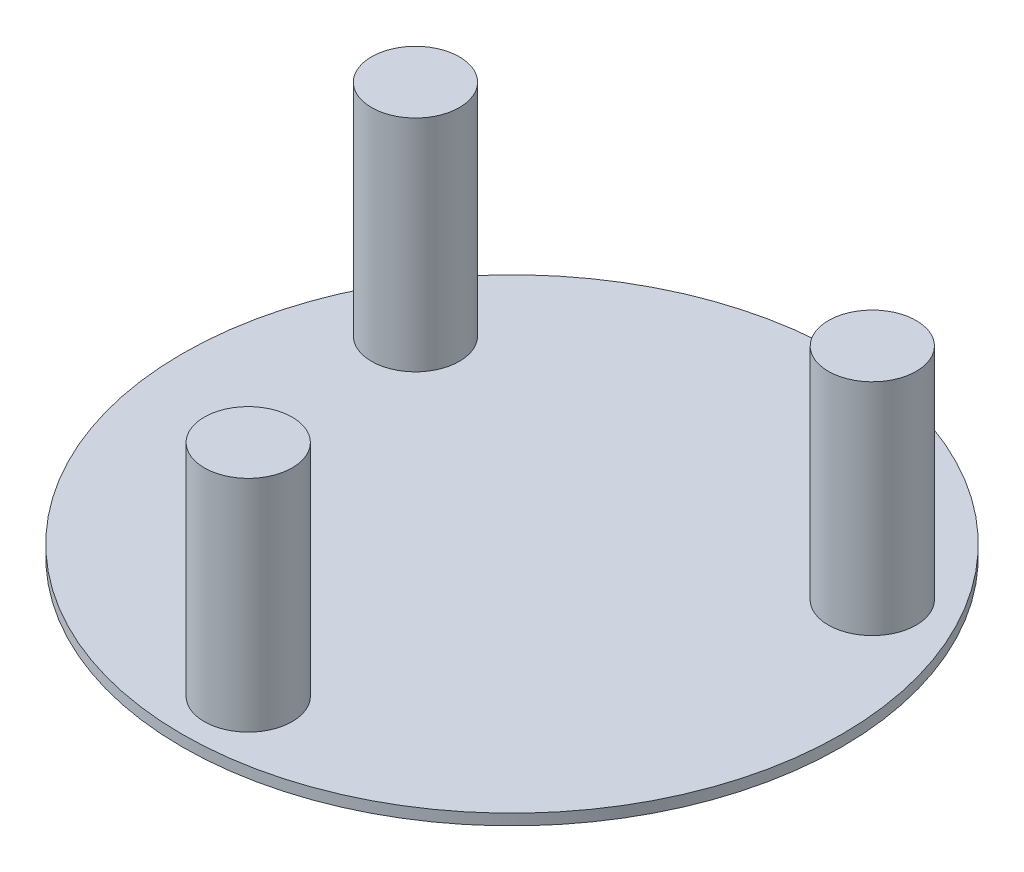
ISO-10303-21;
HEADER;
FILE_DESCRIPTION(('STEP AP214'),'2;1');
FILE_NAME('part.step','',(''),(''),'','','');
FILE_SCHEMA(('AUTOMOTIVE_DESIGN { 1 0 10303 214 1 1 1 1 }'));
ENDSEC;
DATA;
#1=APPLICATION_CONTEXT('core data for automotive mechanical design processes');
#2=APPLICATION_PROTOCOL_DEFINITION('international standard','automotive_design',2000,#1);
#3=PRODUCT_CONTEXT('',#1,'mechanical');
#4=PRODUCT('Part','Part','',(#3));
#5=PRODUCT_RELATED_PRODUCT_CATEGORY('part','',(#4));
#6=PRODUCT_DEFINITION_FORMATION('','',#4);
#7=PRODUCT_DEFINITION_CONTEXT('part definition',#1,'design');
#8=PRODUCT_DEFINITION('design','',#6,#7);
#9=PRODUCT_DEFINITION_SHAPE('','',#8);
#10=(LENGTH_UNIT() NAMED_UNIT(*) SI_UNIT(.MILLI.,.METRE.));
#11=(NAMED_UNIT(*) PLANE_ANGLE_UNIT() SI_UNIT($,.RADIAN.));
#12=(NAMED_UNIT(*) SI_UNIT($,.STERADIAN.) SOLID_ANGLE_UNIT());
#13=UNCERTAINTY_MEASURE_WITH_UNIT(LENGTH_MEASURE(1.E-05),#10,'distance_accuracy_value','');
#14=(GEOMETRIC_REPRESENTATION_CONTEXT(3) GLOBAL_UNCERTAINTY_ASSIGNED_CONTEXT((#13)) GLOBAL_UNIT_ASSIGNED_CONTEXT((#10,
#11,#12)) REPRESENTATION_CONTEXT('',''));
#15=CARTESIAN_POINT('',(0.,0.,0.));
#16=DIRECTION('',(0.,0.,1.));
#17=DIRECTION('',(1.,0.,0.));
#18=AXIS2_PLACEMENT_3D('',#15,#16,#17);
#19=CARTESIAN_POINT('',(0.,5.,0.));
#20=DIRECTION('',(0.,-1.,0.));
#21=DIRECTION('',(0.,0.,-1.));
#22=AXIS2_PLACEMENT_3D('',#19,#20,#21);
#23=CYLINDRICAL_SURFACE('',#22,150.);
#24=CARTESIAN_POINT('',(0.,5.,0.));
#25=DIRECTION('',(0.,1.,0.));
#26=DIRECTION('',(0.,0.,1.));
#27=AXIS2_PLACEMENT_3D('',#24,#25,#26);
#28=CIRCLE('',#27,150.);
#29=CARTESIAN_POINT('',(0.,5.,150.));
#30=VERTEX_POINT('',#29);
#31=EDGE_CURVE('E41',#30,#30,#28,.T.);
#32=ORIENTED_EDGE('',*,*,#31,.F.);
#33=EDGE_LOOP('',(#32));
#34=FACE_BOUND('',#33,.T.);
#35=CARTESIAN_POINT('',(0.,0.,0.));
#36=DIRECTION('',(0.,1.,0.));
#37=DIRECTION('',(0.,0.,1.));
#38=AXIS2_PLACEMENT_3D('',#35,#36,#37);
#39=CIRCLE('',#38,150.);
#40=CARTESIAN_POINT('',(0.,0.,150.));
#41=VERTEX_POINT('',#40);
#42=EDGE_CURVE('E45',#41,#41,#39,.T.);
#43=ORIENTED_EDGE('',*,*,#42,.T.);
#44=EDGE_LOOP('',(#43));
#45=FACE_BOUND('',#44,.T.);
#46=ADVANCED_FACE('F35',(#34,#45),#23,.T.);
#47=CARTESIAN_POINT('',(0.,5.,0.));
#48=DIRECTION('',(0.,1.,0.));
#49=DIRECTION('',(0.,0.,1.));
#50=AXIS2_PLACEMENT_3D('',#47,#48,#49);
#51=PLANE('',#50);
#52=CARTESIAN_POINT('',(-103.923048454133,5.,-59.999999999999));
#53=DIRECTION('',(0.,1.,0.));
#54=DIRECTION('',(-0.866025403784443,0.,-0.499999999999992));
#55=AXIS2_PLACEMENT_3D('',#52,#53,#54);
#56=CIRCLE('',#55,20.);
#57=CARTESIAN_POINT('',(-121.243556529822,5.,-69.9999999999989));
#58=VERTEX_POINT('',#57);
#59=EDGE_CURVE('E64',#58,#58,#56,.T.);
#60=ORIENTED_EDGE('',*,*,#59,.F.);
#61=EDGE_LOOP('',(#60));
#62=FACE_BOUND('',#61,.T.);
#63=CARTESIAN_POINT('',(103.923048454132,5.,-60.0000000000005));
#64=DIRECTION('',(0.,1.,0.));
#65=DIRECTION('',(0.866025403784436,0.,-0.500000000000004));
#66=AXIS2_PLACEMENT_3D('',#63,#64,#65);
#67=CIRCLE('',#66,20.);
#68=CARTESIAN_POINT('',(121.243556529821,5.,-70.0000000000006));
#69=VERTEX_POINT('',#68);
#70=EDGE_CURVE('E58',#69,#69,#67,.T.);
#71=ORIENTED_EDGE('',*,*,#70,.F.);
#72=EDGE_LOOP('',(#71));
#73=FACE_BOUND('',#72,.T.);
#74=CARTESIAN_POINT('',(0.,5.,120.));
#75=DIRECTION('',(0.,1.,0.));
#76=DIRECTION('',(0.,0.,1.));
#77=AXIS2_PLACEMENT_3D('',#74,#75,#76);
#78=CIRCLE('',#77,20.);
#79=CARTESIAN_POINT('',(0.,5.,140.));
#80=VERTEX_POINT('',#79);
#81=EDGE_CURVE('E52',#80,#80,#78,.T.);
#82=ORIENTED_EDGE('',*,*,#81,.F.);
#83=EDGE_LOOP('',(#82));
#84=FACE_BOUND('',#83,.T.);
#85=ORIENTED_EDGE('',*,*,#31,.T.);
#86=EDGE_LOOP('',(#85));
#87=FACE_BOUND('',#86,.T.);
#88=ADVANCED_FACE('F88',(#62,#73,#84,#87),#51,.T.);
#89=CARTESIAN_POINT('',(0.,0.,0.));
#90=DIRECTION('',(0.,1.,0.));
#91=DIRECTION('',(0.,0.,1.));
#92=AXIS2_PLACEMENT_3D('',#89,#90,#91);
#93=PLANE('',#92);
#94=CARTESIAN_POINT('',(0.,0.,0.));
#95=DIRECTION('',(0.,1.,0.));
#96=DIRECTION('',(0.,0.,1.));
#97=AXIS2_PLACEMENT_3D('',#94,#95,#96);
#98=CIRCLE('',#97,2.5);
#99=CARTESIAN_POINT('',(0.,0.,2.5));
#100=VERTEX_POINT('',#99);
#101=EDGE_CURVE('E10',#100,#100,#98,.F.);
#102=ORIENTED_EDGE('',*,*,#101,.F.);
#103=EDGE_LOOP('',(#102));
#104=FACE_BOUND('',#103,.T.);
#105=ORIENTED_EDGE('',*,*,#42,.F.);
#106=EDGE_LOOP('',(#105));
#107=FACE_BOUND('',#106,.T.);
#108=ADVANCED_FACE('F93',(#104,#107),#93,.F.);
#109=CARTESIAN_POINT('',(0.,105.,120.));
#110=DIRECTION('',(0.,-1.,0.));
#111=DIRECTION('',(0.,0.,-1.));
#112=AXIS2_PLACEMENT_3D('',#109,#110,#111);
#113=CYLINDRICAL_SURFACE('',#112,20.);
#114=CARTESIAN_POINT('',(0.,105.,120.));
#115=DIRECTION('',(0.,1.,0.));
#116=DIRECTION('',(0.,0.,1.));
#117=AXIS2_PLACEMENT_3D('',#114,#115,#116);
#118=CIRCLE('',#117,20.);
#119=CARTESIAN_POINT('',(0.,105.,140.));
#120=VERTEX_POINT('',#119);
#121=EDGE_CURVE('E50',#120,#120,#118,.T.);
#122=ORIENTED_EDGE('',*,*,#121,.F.);
#123=EDGE_LOOP('',(#122));
#124=FACE_BOUND('',#123,.T.);
#125=ORIENTED_EDGE('',*,*,#81,.T.);
#126=EDGE_LOOP('',(#125));
#127=FACE_BOUND('',#126,.T.);
#128=ADVANCED_FACE('F100',(#124,#127),#113,.T.);
#129=CARTESIAN_POINT('',(0.,105.,120.));
#130=DIRECTION('',(0.,1.,0.));
#131=DIRECTION('',(0.,0.,1.));
#132=AXIS2_PLACEMENT_3D('',#129,#130,#131);
#133=PLANE('',#132);
#134=ORIENTED_EDGE('',*,*,#121,.T.);
#135=EDGE_LOOP('',(#134));
#136=FACE_BOUND('',#135,.T.);
#137=ADVANCED_FACE('F105',(#136),#133,.T.);
#138=CARTESIAN_POINT('',(103.923048454132,105.,-60.0000000000005));
#139=DIRECTION('',(0.,-1.,0.));
#140=DIRECTION('',(0.,0.,-1.));
#141=AXIS2_PLACEMENT_3D('',#138,#139,#140);
#142=CYLINDRICAL_SURFACE('',#141,20.);
#143=CARTESIAN_POINT('',(103.923048454132,105.,-60.0000000000005));
#144=DIRECTION('',(0.,1.,0.));
#145=DIRECTION('',(0.866025403784436,0.,-0.500000000000004));
#146=AXIS2_PLACEMENT_3D('',#143,#144,#145);
#147=CIRCLE('',#146,20.);
#148=CARTESIAN_POINT('',(121.243556529821,105.,-70.0000000000006));
#149=VERTEX_POINT('',#148);
#150=EDGE_CURVE('E55',#149,#149,#147,.T.);
#151=ORIENTED_EDGE('',*,*,#150,.F.);
#152=EDGE_LOOP('',(#151));
#153=FACE_BOUND('',#152,.T.);
#154=ORIENTED_EDGE('',*,*,#70,.T.);
#155=EDGE_LOOP('',(#154));
#156=FACE_BOUND('',#155,.T.);
#157=ADVANCED_FACE('F111',(#153,#156),#142,.T.);
#158=CARTESIAN_POINT('',(103.923048454132,105.,-60.0000000000005));
#159=DIRECTION('',(0.,1.,0.));
#160=DIRECTION('',(0.866025403784436,0.,-0.500000000000004));
#161=AXIS2_PLACEMENT_3D('',#158,#159,#160);
#162=PLANE('',#161);
#163=ORIENTED_EDGE('',*,*,#150,.T.);
#164=EDGE_LOOP('',(#163));
#165=FACE_BOUND('',#164,.T.);
#166=ADVANCED_FACE('F115',(#165),#162,.T.);
#167=CARTESIAN_POINT('',(-103.923048454133,105.,-59.999999999999));
#168=DIRECTION('',(0.,-1.,0.));
#169=DIRECTION('',(0.,0.,-1.));
#170=AXIS2_PLACEMENT_3D('',#167,#168,#169);
#171=CYLINDRICAL_SURFACE('',#170,20.);
#172=CARTESIAN_POINT('',(-103.923048454133,105.,-59.999999999999));
#173=DIRECTION('',(0.,1.,0.));
#174=DIRECTION('',(-0.866025403784443,0.,-0.499999999999992));
#175=AXIS2_PLACEMENT_3D('',#172,#173,#174);
#176=CIRCLE('',#175,20.);
#177=CARTESIAN_POINT('',(-121.243556529822,105.,-69.9999999999989));
#178=VERTEX_POINT('',#177);
#179=EDGE_CURVE('E61',#178,#178,#176,.T.);
#180=ORIENTED_EDGE('',*,*,#179,.F.);
#181=EDGE_LOOP('',(#180));
#182=FACE_BOUND('',#181,.T.);
#183=ORIENTED_EDGE('',*,*,#59,.T.);
#184=EDGE_LOOP('',(#183));
#185=FACE_BOUND('',#184,.T.);
#186=ADVANCED_FACE('F84',(#182,#185),#171,.T.);
#187=CARTESIAN_POINT('',(-103.923048454133,105.,-59.999999999999));
#188=DIRECTION('',(0.,1.,0.));
#189=DIRECTION('',(-0.866025403784443,0.,-0.499999999999992));
#190=AXIS2_PLACEMENT_3D('',#187,#188,#189);
#191=PLANE('',#190);
#192=ORIENTED_EDGE('',*,*,#179,.T.);
#193=EDGE_LOOP('',(#192));
#194=FACE_BOUND('',#193,.T.);
#195=ADVANCED_FACE('F77',(#194),#191,.T.);
#196=CARTESIAN_POINT('',(0.,-15.,0.));
#197=DIRECTION('',(0.,1.,0.));
#198=DIRECTION('',(0.,0.,1.));
#199=AXIS2_PLACEMENT_3D('',#196,#197,#198);
#200=CYLINDRICAL_SURFACE('',#199,2.5);
#201=CARTESIAN_POINT('',(0.,-15.,0.));
#202=DIRECTION('',(0.,-1.,0.));
#203=DIRECTION('',(0.,0.,-1.));
#204=AXIS2_PLACEMENT_3D('',#201,#202,#203);
#205=CIRCLE('',#204,2.5);
#206=CARTESIAN_POINT('',(0.,-15.,-2.5));
#207=VERTEX_POINT('',#206);
#208=EDGE_CURVE('E67',#207,#207,#205,.T.);
#209=ORIENTED_EDGE('',*,*,#208,.F.);
#210=EDGE_LOOP('',(#209));
#211=FACE_BOUND('',#210,.T.);
#212=ORIENTED_EDGE('',*,*,#101,.T.);
#213=EDGE_LOOP('',(#212));
#214=FACE_BOUND('',#213,.T.);
#215=ADVANCED_FACE('F75',(#211,#214),#200,.T.);
#216=CARTESIAN_POINT('',(0.,-15.,0.));
#217=DIRECTION('',(0.,-1.,0.));
#218=DIRECTION('',(0.,0.,-1.));
#219=AXIS2_PLACEMENT_3D('',#216,#217,#218);
#220=PLANE('',#219);
#221=ORIENTED_EDGE('',*,*,#208,.T.);
#222=EDGE_LOOP('',(#221));
#223=FACE_BOUND('',#222,.T.);
#224=ADVANCED_FACE('F73',(#223),#220,.T.);
#225=CLOSED_SHELL('',(#46,#88,#108,#128,#137,#157,#166,#186,#195,#215,#224));
#226=MANIFOLD_SOLID_BREP('B2',#225);
#227=ADVANCED_BREP_SHAPE_REPRESENTATION('',(#18,#226),#14);
#228=SHAPE_DEFINITION_REPRESENTATION(#9,#227);
ENDSEC;
END-ISO-10303-21;
